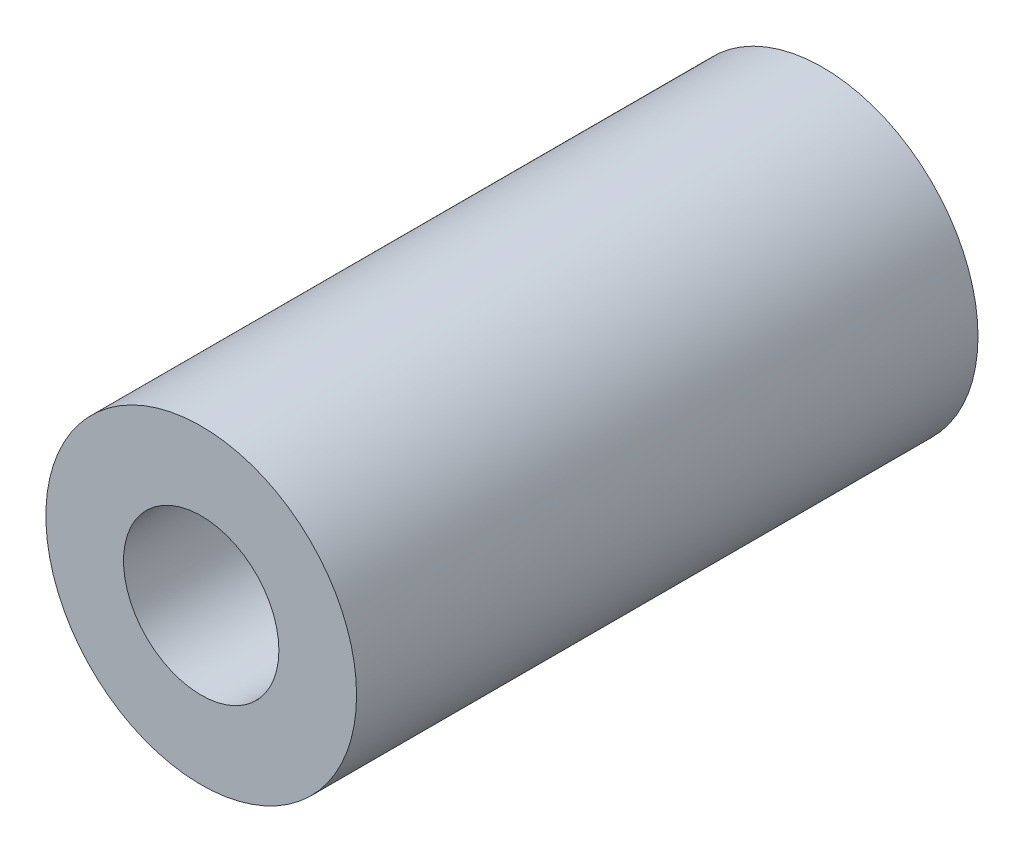
ISO-10303-21;
HEADER;
FILE_DESCRIPTION(('STEP AP214'),'2;1');
FILE_NAME('part.step','',(''),(''),'','','');
FILE_SCHEMA(('AUTOMOTIVE_DESIGN { 1 0 10303 214 1 1 1 1 }'));
ENDSEC;
DATA;
#1=APPLICATION_CONTEXT('core data for automotive mechanical design processes');
#2=APPLICATION_PROTOCOL_DEFINITION('international standard','automotive_design',2000,#1);
#3=PRODUCT_CONTEXT('',#1,'mechanical');
#4=PRODUCT('Part','Part','',(#3));
#5=PRODUCT_RELATED_PRODUCT_CATEGORY('part','',(#4));
#6=PRODUCT_DEFINITION_FORMATION('','',#4);
#7=PRODUCT_DEFINITION_CONTEXT('part definition',#1,'design');
#8=PRODUCT_DEFINITION('design','',#6,#7);
#9=PRODUCT_DEFINITION_SHAPE('','',#8);
#10=(LENGTH_UNIT() NAMED_UNIT(*) SI_UNIT(.MILLI.,.METRE.));
#11=(NAMED_UNIT(*) PLANE_ANGLE_UNIT() SI_UNIT($,.RADIAN.));
#12=(NAMED_UNIT(*) SI_UNIT($,.STERADIAN.) SOLID_ANGLE_UNIT());
#13=UNCERTAINTY_MEASURE_WITH_UNIT(LENGTH_MEASURE(1.E-05),#10,'distance_accuracy_value','');
#14=(GEOMETRIC_REPRESENTATION_CONTEXT(3) GLOBAL_UNCERTAINTY_ASSIGNED_CONTEXT((#13)) GLOBAL_UNIT_ASSIGNED_CONTEXT((#10,
#11,#12)) REPRESENTATION_CONTEXT('',''));
#15=CARTESIAN_POINT('',(0.,0.,0.));
#16=DIRECTION('',(0.,0.,1.));
#17=DIRECTION('',(1.,0.,0.));
#18=AXIS2_PLACEMENT_3D('',#15,#16,#17);
#19=CARTESIAN_POINT('',(0.,0.,8.));
#20=DIRECTION('',(0.,0.,1.));
#21=DIRECTION('',(1.,0.,0.));
#22=AXIS2_PLACEMENT_3D('',#19,#20,#21);
#23=PLANE('',#22);
#24=CARTESIAN_POINT('',(0.,0.,8.));
#25=DIRECTION('',(0.,0.,1.));
#26=DIRECTION('',(1.,0.,0.));
#27=AXIS2_PLACEMENT_3D('',#24,#25,#26);
#28=CIRCLE('',#27,2.);
#29=CARTESIAN_POINT('',(2.,0.,8.));
#30=VERTEX_POINT('',#29);
#31=EDGE_CURVE('E10',#30,#30,#28,.T.);
#32=ORIENTED_EDGE('',*,*,#31,.T.);
#33=EDGE_LOOP('',(#32));
#34=FACE_BOUND('',#33,.T.);
#35=CARTESIAN_POINT('',(0.,0.,8.));
#36=DIRECTION('',(0.,0.,1.));
#37=DIRECTION('',(1.,0.,0.));
#38=AXIS2_PLACEMENT_3D('',#35,#36,#37);
#39=CIRCLE('',#38,1.);
#40=CARTESIAN_POINT('',(1.,0.,8.));
#41=VERTEX_POINT('',#40);
#42=EDGE_CURVE('E44',#41,#41,#39,.T.);
#43=ORIENTED_EDGE('',*,*,#42,.F.);
#44=EDGE_LOOP('',(#43));
#45=FACE_BOUND('',#44,.T.);
#46=ADVANCED_FACE('F33',(#34,#45),#23,.T.);
#47=CARTESIAN_POINT('',(0.,0.,0.));
#48=DIRECTION('',(0.,0.,1.));
#49=DIRECTION('',(1.,0.,0.));
#50=AXIS2_PLACEMENT_3D('',#47,#48,#49);
#51=PLANE('',#50);
#52=CARTESIAN_POINT('',(0.,0.,0.));
#53=DIRECTION('',(0.,0.,1.));
#54=DIRECTION('',(1.,0.,0.));
#55=AXIS2_PLACEMENT_3D('',#52,#53,#54);
#56=CIRCLE('',#55,2.);
#57=CARTESIAN_POINT('',(2.,0.,0.));
#58=VERTEX_POINT('',#57);
#59=EDGE_CURVE('E37',#58,#58,#56,.T.);
#60=ORIENTED_EDGE('',*,*,#59,.F.);
#61=EDGE_LOOP('',(#60));
#62=FACE_BOUND('',#61,.T.);
#63=CARTESIAN_POINT('',(0.,0.,0.));
#64=DIRECTION('',(0.,0.,1.));
#65=DIRECTION('',(1.,0.,0.));
#66=AXIS2_PLACEMENT_3D('',#63,#64,#65);
#67=CIRCLE('',#66,1.);
#68=CARTESIAN_POINT('',(1.,0.,0.));
#69=VERTEX_POINT('',#68);
#70=EDGE_CURVE('E46',#69,#69,#67,.T.);
#71=ORIENTED_EDGE('',*,*,#70,.T.);
#72=EDGE_LOOP('',(#71));
#73=FACE_BOUND('',#72,.T.);
#74=ADVANCED_FACE('F56',(#62,#73),#51,.F.);
#75=CARTESIAN_POINT('',(0.,0.,8.));
#76=DIRECTION('',(0.,0.,-1.));
#77=DIRECTION('',(-1.,0.,0.));
#78=AXIS2_PLACEMENT_3D('',#75,#76,#77);
#79=CYLINDRICAL_SURFACE('',#78,2.);
#80=ORIENTED_EDGE('',*,*,#31,.F.);
#81=EDGE_LOOP('',(#80));
#82=FACE_BOUND('',#81,.T.);
#83=ORIENTED_EDGE('',*,*,#59,.T.);
#84=EDGE_LOOP('',(#83));
#85=FACE_BOUND('',#84,.T.);
#86=ADVANCED_FACE('F35',(#82,#85),#79,.T.);
#87=CARTESIAN_POINT('',(0.,0.,8.));
#88=DIRECTION('',(0.,0.,-1.));
#89=DIRECTION('',(-1.,0.,0.));
#90=AXIS2_PLACEMENT_3D('',#87,#88,#89);
#91=CYLINDRICAL_SURFACE('',#90,1.);
#92=ORIENTED_EDGE('',*,*,#42,.T.);
#93=EDGE_LOOP('',(#92));
#94=FACE_BOUND('',#93,.T.);
#95=ORIENTED_EDGE('',*,*,#70,.F.);
#96=EDGE_LOOP('',(#95));
#97=FACE_BOUND('',#96,.T.);
#98=ADVANCED_FACE('F52',(#94,#97),#91,.F.);
#99=CLOSED_SHELL('',(#46,#74,#86,#98));
#100=MANIFOLD_SOLID_BREP('B2',#99);
#101=ADVANCED_BREP_SHAPE_REPRESENTATION('',(#18,#100),#14);
#102=SHAPE_DEFINITION_REPRESENTATION(#9,#101);
ENDSEC;
END-ISO-10303-21;
